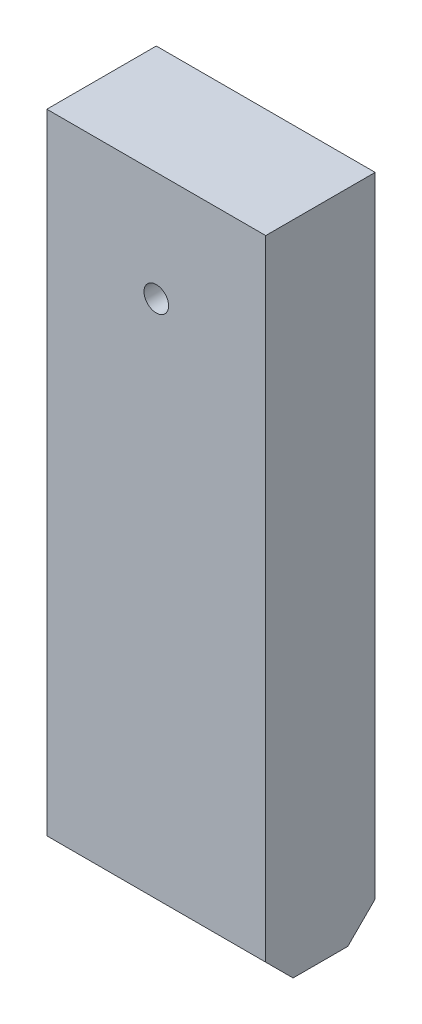
ISO-10303-21;
HEADER;
FILE_DESCRIPTION(('STEP AP214'),'2;1');
FILE_NAME('part.step','',(''),(''),'','','');
FILE_SCHEMA(('AUTOMOTIVE_DESIGN { 1 0 10303 214 1 1 1 1 }'));
ENDSEC;
DATA;
#1=APPLICATION_CONTEXT('core data for automotive mechanical design processes');
#2=APPLICATION_PROTOCOL_DEFINITION('international standard','automotive_design',2000,#1);
#3=PRODUCT_CONTEXT('',#1,'mechanical');
#4=PRODUCT('Part','Part','',(#3));
#5=PRODUCT_RELATED_PRODUCT_CATEGORY('part','',(#4));
#6=PRODUCT_DEFINITION_FORMATION('','',#4);
#7=PRODUCT_DEFINITION_CONTEXT('part definition',#1,'design');
#8=PRODUCT_DEFINITION('design','',#6,#7);
#9=PRODUCT_DEFINITION_SHAPE('','',#8);
#10=(LENGTH_UNIT() NAMED_UNIT(*) SI_UNIT(.MILLI.,.METRE.));
#11=(NAMED_UNIT(*) PLANE_ANGLE_UNIT() SI_UNIT($,.RADIAN.));
#12=(NAMED_UNIT(*) SI_UNIT($,.STERADIAN.) SOLID_ANGLE_UNIT());
#13=UNCERTAINTY_MEASURE_WITH_UNIT(LENGTH_MEASURE(1.E-05),#10,'distance_accuracy_value','');
#14=(GEOMETRIC_REPRESENTATION_CONTEXT(3) GLOBAL_UNCERTAINTY_ASSIGNED_CONTEXT((#13)) GLOBAL_UNIT_ASSIGNED_CONTEXT((#10,
#11,#12)) REPRESENTATION_CONTEXT('',''));
#15=CARTESIAN_POINT('',(0.,0.,0.));
#16=DIRECTION('',(0.,0.,1.));
#17=DIRECTION('',(1.,0.,0.));
#18=AXIS2_PLACEMENT_3D('',#15,#16,#17);
#19=CARTESIAN_POINT('',(0.,0.,20.));
#20=DIRECTION('',(1.,0.,0.));
#21=DIRECTION('',(0.,0.,-1.));
#22=AXIS2_PLACEMENT_3D('',#19,#20,#21);
#23=PLANE('',#22);
#24=DIRECTION('',(0.,-1.,0.));
#25=VECTOR('',#24,1.);
#26=CARTESIAN_POINT('',(0.,0.,0.));
#27=LINE('',#26,#25);
#28=CARTESIAN_POINT('',(0.,120.,0.));
#29=VERTEX_POINT('',#28);
#30=CARTESIAN_POINT('',(0.,5.00000000000002,0.));
#31=VERTEX_POINT('',#30);
#32=EDGE_CURVE('E118',#29,#31,#27,.T.);
#33=ORIENTED_EDGE('',*,*,#32,.T.);
#34=DIRECTION('',(0.,-0.70710678118655,0.707106781186546));
#35=VECTOR('',#34,1.);
#36=CARTESIAN_POINT('',(0.,0.,4.99999999999999));
#37=LINE('',#36,#35);
#38=CARTESIAN_POINT('',(0.,0.,4.99999999999999));
#39=VERTEX_POINT('',#38);
#40=EDGE_CURVE('E44',#31,#39,#37,.T.);
#41=ORIENTED_EDGE('',*,*,#40,.T.);
#42=DIRECTION('',(0.,0.,-1.));
#43=VECTOR('',#42,1.);
#44=CARTESIAN_POINT('',(0.,0.,20.));
#45=LINE('',#44,#43);
#46=CARTESIAN_POINT('',(0.,0.,15.));
#47=VERTEX_POINT('',#46);
#48=EDGE_CURVE('E125',#47,#39,#45,.T.);
#49=ORIENTED_EDGE('',*,*,#48,.F.);
#50=DIRECTION('',(0.,-0.707106781186546,-0.70710678118655));
#51=VECTOR('',#50,1.);
#52=CARTESIAN_POINT('',(0.,4.99999999999999,20.));
#53=LINE('',#52,#51);
#54=CARTESIAN_POINT('',(0.,4.99999999999999,20.));
#55=VERTEX_POINT('',#54);
#56=EDGE_CURVE('E51',#47,#55,#53,.F.);
#57=ORIENTED_EDGE('',*,*,#56,.T.);
#58=DIRECTION('',(0.,-1.,0.));
#59=VECTOR('',#58,1.);
#60=CARTESIAN_POINT('',(0.,0.,20.));
#61=LINE('',#60,#59);
#62=CARTESIAN_POINT('',(0.,120.,20.));
#63=VERTEX_POINT('',#62);
#64=EDGE_CURVE('E100',#63,#55,#61,.T.);
#65=ORIENTED_EDGE('',*,*,#64,.F.);
#66=DIRECTION('',(0.,0.,-1.));
#67=VECTOR('',#66,1.);
#68=CARTESIAN_POINT('',(0.,120.,20.));
#69=LINE('',#68,#67);
#70=EDGE_CURVE('E110',#63,#29,#69,.T.);
#71=ORIENTED_EDGE('',*,*,#70,.T.);
#72=EDGE_LOOP('',(#33,#41,#49,#57,#65,#71));
#73=FACE_BOUND('',#72,.T.);
#74=ADVANCED_FACE('F35',(#73),#23,.F.);
#75=CARTESIAN_POINT('',(0.,0.,20.));
#76=DIRECTION('',(0.,1.,0.));
#77=DIRECTION('',(0.,0.,1.));
#78=AXIS2_PLACEMENT_3D('',#75,#76,#77);
#79=PLANE('',#78);
#80=ORIENTED_EDGE('',*,*,#48,.T.);
#81=DIRECTION('',(1.,0.,0.));
#82=VECTOR('',#81,1.);
#83=CARTESIAN_POINT('',(40.,0.,4.99999999999999));
#84=LINE('',#83,#82);
#85=CARTESIAN_POINT('',(40.,0.,4.99999999999999));
#86=VERTEX_POINT('',#85);
#87=EDGE_CURVE('E130',#39,#86,#84,.T.);
#88=ORIENTED_EDGE('',*,*,#87,.T.);
#89=DIRECTION('',(0.,0.,-1.));
#90=VECTOR('',#89,1.);
#91=CARTESIAN_POINT('',(40.,0.,20.));
#92=LINE('',#91,#90);
#93=CARTESIAN_POINT('',(40.,0.,15.));
#94=VERTEX_POINT('',#93);
#95=EDGE_CURVE('E109',#94,#86,#92,.T.);
#96=ORIENTED_EDGE('',*,*,#95,.F.);
#97=DIRECTION('',(-1.,0.,0.));
#98=VECTOR('',#97,1.);
#99=CARTESIAN_POINT('',(0.,0.,15.));
#100=LINE('',#99,#98);
#101=EDGE_CURVE('E128',#94,#47,#100,.T.);
#102=ORIENTED_EDGE('',*,*,#101,.T.);
#103=EDGE_LOOP('',(#80,#88,#96,#102));
#104=FACE_BOUND('',#103,.T.);
#105=ADVANCED_FACE('F142',(#104),#79,.F.);
#106=CARTESIAN_POINT('',(40.,0.,20.));
#107=DIRECTION('',(-1.,0.,0.));
#108=DIRECTION('',(0.,0.,1.));
#109=AXIS2_PLACEMENT_3D('',#106,#107,#108);
#110=PLANE('',#109);
#111=ORIENTED_EDGE('',*,*,#95,.T.);
#112=DIRECTION('',(0.,0.70710678118655,-0.707106781186546));
#113=VECTOR('',#112,1.);
#114=CARTESIAN_POINT('',(40.,0.,4.99999999999999));
#115=LINE('',#114,#113);
#116=CARTESIAN_POINT('',(40.,5.00000000000002,0.));
#117=VERTEX_POINT('',#116);
#118=EDGE_CURVE('E135',#86,#117,#115,.T.);
#119=ORIENTED_EDGE('',*,*,#118,.T.);
#120=DIRECTION('',(0.,1.,0.));
#121=VECTOR('',#120,1.);
#122=CARTESIAN_POINT('',(40.,0.,0.));
#123=LINE('',#122,#121);
#124=CARTESIAN_POINT('',(40.,120.,0.));
#125=VERTEX_POINT('',#124);
#126=EDGE_CURVE('E106',#117,#125,#123,.T.);
#127=ORIENTED_EDGE('',*,*,#126,.T.);
#128=DIRECTION('',(0.,0.,-1.));
#129=VECTOR('',#128,1.);
#130=CARTESIAN_POINT('',(40.,120.,20.));
#131=LINE('',#130,#129);
#132=CARTESIAN_POINT('',(40.,120.,20.));
#133=VERTEX_POINT('',#132);
#134=EDGE_CURVE('E103',#133,#125,#131,.T.);
#135=ORIENTED_EDGE('',*,*,#134,.F.);
#136=DIRECTION('',(0.,1.,0.));
#137=VECTOR('',#136,1.);
#138=CARTESIAN_POINT('',(40.,0.,20.));
#139=LINE('',#138,#137);
#140=CARTESIAN_POINT('',(40.,4.99999999999999,20.));
#141=VERTEX_POINT('',#140);
#142=EDGE_CURVE('E92',#141,#133,#139,.T.);
#143=ORIENTED_EDGE('',*,*,#142,.F.);
#144=DIRECTION('',(0.,0.707106781186546,0.70710678118655));
#145=VECTOR('',#144,1.);
#146=CARTESIAN_POINT('',(40.,4.99999999999999,20.));
#147=LINE('',#146,#145);
#148=EDGE_CURVE('E133',#141,#94,#147,.F.);
#149=ORIENTED_EDGE('',*,*,#148,.T.);
#150=EDGE_LOOP('',(#111,#119,#127,#135,#143,#149));
#151=FACE_BOUND('',#150,.T.);
#152=ADVANCED_FACE('F105',(#151),#110,.F.);
#153=CARTESIAN_POINT('',(0.,120.,20.));
#154=DIRECTION('',(0.,-1.,0.));
#155=DIRECTION('',(0.,0.,-1.));
#156=AXIS2_PLACEMENT_3D('',#153,#154,#155);
#157=PLANE('',#156);
#158=DIRECTION('',(-1.,0.,0.));
#159=VECTOR('',#158,1.);
#160=CARTESIAN_POINT('',(0.,120.,0.));
#161=LINE('',#160,#159);
#162=EDGE_CURVE('E122',#125,#29,#161,.T.);
#163=ORIENTED_EDGE('',*,*,#162,.T.);
#164=ORIENTED_EDGE('',*,*,#70,.F.);
#165=DIRECTION('',(-1.,0.,0.));
#166=VECTOR('',#165,1.);
#167=CARTESIAN_POINT('',(0.,120.,20.));
#168=LINE('',#167,#166);
#169=EDGE_CURVE('E96',#133,#63,#168,.T.);
#170=ORIENTED_EDGE('',*,*,#169,.F.);
#171=ORIENTED_EDGE('',*,*,#134,.T.);
#172=EDGE_LOOP('',(#163,#164,#170,#171));
#173=FACE_BOUND('',#172,.T.);
#174=ADVANCED_FACE('F112',(#173),#157,.F.);
#175=CARTESIAN_POINT('',(0.,0.,20.));
#176=DIRECTION('',(0.,0.,-1.));
#177=DIRECTION('',(-1.,0.,0.));
#178=AXIS2_PLACEMENT_3D('',#175,#176,#177);
#179=PLANE('',#178);
#180=CARTESIAN_POINT('',(20.,100.,20.));
#181=DIRECTION('',(0.,0.,-1.));
#182=DIRECTION('',(-1.,0.,0.));
#183=AXIS2_PLACEMENT_3D('',#180,#181,#182);
#184=CIRCLE('',#183,2.25);
#185=CARTESIAN_POINT('',(17.75,100.,20.));
#186=VERTEX_POINT('',#185);
#187=EDGE_CURVE('E120',#186,#186,#184,.T.);
#188=ORIENTED_EDGE('',*,*,#187,.T.);
#189=EDGE_LOOP('',(#188));
#190=FACE_BOUND('',#189,.T.);
#191=ORIENTED_EDGE('',*,*,#64,.T.);
#192=DIRECTION('',(1.,0.,0.));
#193=VECTOR('',#192,1.);
#194=CARTESIAN_POINT('',(0.,4.99999999999999,20.));
#195=LINE('',#194,#193);
#196=EDGE_CURVE('E11',#55,#141,#195,.T.);
#197=ORIENTED_EDGE('',*,*,#196,.T.);
#198=ORIENTED_EDGE('',*,*,#142,.T.);
#199=ORIENTED_EDGE('',*,*,#169,.T.);
#200=EDGE_LOOP('',(#191,#197,#198,#199));
#201=FACE_BOUND('',#200,.T.);
#202=ADVANCED_FACE('F94',(#190,#201),#179,.F.);
#203=CARTESIAN_POINT('',(0.,0.,0.));
#204=DIRECTION('',(0.,0.,-1.));
#205=DIRECTION('',(-1.,0.,0.));
#206=AXIS2_PLACEMENT_3D('',#203,#204,#205);
#207=PLANE('',#206);
#208=CARTESIAN_POINT('',(20.,100.,0.));
#209=DIRECTION('',(0.,0.,1.));
#210=DIRECTION('',(1.,0.,0.));
#211=AXIS2_PLACEMENT_3D('',#208,#209,#210);
#212=CIRCLE('',#211,2.25);
#213=CARTESIAN_POINT('',(22.25,100.,0.));
#214=VERTEX_POINT('',#213);
#215=EDGE_CURVE('E150',#214,#214,#212,.T.);
#216=ORIENTED_EDGE('',*,*,#215,.T.);
#217=EDGE_LOOP('',(#216));
#218=FACE_BOUND('',#217,.T.);
#219=ORIENTED_EDGE('',*,*,#126,.F.);
#220=DIRECTION('',(-1.,0.,0.));
#221=VECTOR('',#220,1.);
#222=CARTESIAN_POINT('',(0.,5.00000000000002,0.));
#223=LINE('',#222,#221);
#224=EDGE_CURVE('E59',#117,#31,#223,.T.);
#225=ORIENTED_EDGE('',*,*,#224,.T.);
#226=ORIENTED_EDGE('',*,*,#32,.F.);
#227=ORIENTED_EDGE('',*,*,#162,.F.);
#228=EDGE_LOOP('',(#219,#225,#226,#227));
#229=FACE_BOUND('',#228,.T.);
#230=ADVANCED_FACE('F146',(#218,#229),#207,.T.);
#231=CARTESIAN_POINT('',(0.,0.,4.99999999999999));
#232=DIRECTION('',(0.,-0.707106781186545,-0.707106781186549));
#233=DIRECTION('',(-1.,0.,0.));
#234=AXIS2_PLACEMENT_3D('',#231,#232,#233);
#235=PLANE('',#234);
#236=ORIENTED_EDGE('',*,*,#40,.F.);
#237=ORIENTED_EDGE('',*,*,#224,.F.);
#238=ORIENTED_EDGE('',*,*,#118,.F.);
#239=ORIENTED_EDGE('',*,*,#87,.F.);
#240=EDGE_LOOP('',(#236,#237,#238,#239));
#241=FACE_BOUND('',#240,.T.);
#242=ADVANCED_FACE('F145',(#241),#235,.T.);
#243=CARTESIAN_POINT('',(0.,4.99999999999999,20.));
#244=DIRECTION('',(0.,0.707106781186549,-0.707106781186545));
#245=DIRECTION('',(1.,0.,0.));
#246=AXIS2_PLACEMENT_3D('',#243,#244,#245);
#247=PLANE('',#246);
#248=ORIENTED_EDGE('',*,*,#56,.F.);
#249=ORIENTED_EDGE('',*,*,#101,.F.);
#250=ORIENTED_EDGE('',*,*,#148,.F.);
#251=ORIENTED_EDGE('',*,*,#196,.F.);
#252=EDGE_LOOP('',(#248,#249,#250,#251));
#253=FACE_BOUND('',#252,.T.);
#254=ADVANCED_FACE('F38',(#253),#247,.F.);
#255=CARTESIAN_POINT('',(20.,100.,0.));
#256=DIRECTION('',(0.,0.,1.));
#257=DIRECTION('',(1.,0.,0.));
#258=AXIS2_PLACEMENT_3D('',#255,#256,#257);
#259=CYLINDRICAL_SURFACE('',#258,2.25);
#260=ORIENTED_EDGE('',*,*,#215,.F.);
#261=EDGE_LOOP('',(#260));
#262=FACE_BOUND('',#261,.T.);
#263=ORIENTED_EDGE('',*,*,#187,.F.);
#264=EDGE_LOOP('',(#263));
#265=FACE_BOUND('',#264,.T.);
#266=ADVANCED_FACE('F155',(#262,#265),#259,.F.);
#267=CLOSED_SHELL('',(#74,#105,#152,#174,#202,#230,#242,#254,#266));
#268=MANIFOLD_SOLID_BREP('B2',#267);
#269=ADVANCED_BREP_SHAPE_REPRESENTATION('',(#18,#268),#14);
#270=SHAPE_DEFINITION_REPRESENTATION(#9,#269);
ENDSEC;
END-ISO-10303-21;
